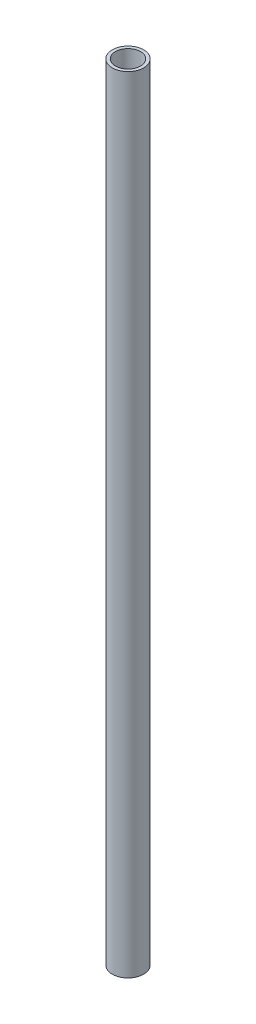
ISO-10303-21;
HEADER;
FILE_DESCRIPTION(('STEP AP214'),'2;1');
FILE_NAME('part.step','',(''),(''),'','','');
FILE_SCHEMA(('AUTOMOTIVE_DESIGN { 1 0 10303 214 1 1 1 1 }'));
ENDSEC;
DATA;
#1=APPLICATION_CONTEXT('core data for automotive mechanical design processes');
#2=APPLICATION_PROTOCOL_DEFINITION('international standard','automotive_design',2000,#1);
#3=PRODUCT_CONTEXT('',#1,'mechanical');
#4=PRODUCT('Part','Part','',(#3));
#5=PRODUCT_RELATED_PRODUCT_CATEGORY('part','',(#4));
#6=PRODUCT_DEFINITION_FORMATION('','',#4);
#7=PRODUCT_DEFINITION_CONTEXT('part definition',#1,'design');
#8=PRODUCT_DEFINITION('design','',#6,#7);
#9=PRODUCT_DEFINITION_SHAPE('','',#8);
#10=(LENGTH_UNIT() NAMED_UNIT(*) SI_UNIT(.MILLI.,.METRE.));
#11=(NAMED_UNIT(*) PLANE_ANGLE_UNIT() SI_UNIT($,.RADIAN.));
#12=(NAMED_UNIT(*) SI_UNIT($,.STERADIAN.) SOLID_ANGLE_UNIT());
#13=UNCERTAINTY_MEASURE_WITH_UNIT(LENGTH_MEASURE(1.E-05),#10,'distance_accuracy_value','');
#14=(GEOMETRIC_REPRESENTATION_CONTEXT(3) GLOBAL_UNCERTAINTY_ASSIGNED_CONTEXT((#13)) GLOBAL_UNIT_ASSIGNED_CONTEXT((#10,
#11,#12)) REPRESENTATION_CONTEXT('',''));
#15=CARTESIAN_POINT('',(0.,0.,0.));
#16=DIRECTION('',(0.,0.,1.));
#17=DIRECTION('',(1.,0.,0.));
#18=AXIS2_PLACEMENT_3D('',#15,#16,#17);
#19=CARTESIAN_POINT('',(0.,500.,0.));
#20=DIRECTION('',(0.,1.,0.));
#21=DIRECTION('',(0.,0.,1.));
#22=AXIS2_PLACEMENT_3D('',#19,#20,#21);
#23=PLANE('',#22);
#24=CARTESIAN_POINT('',(0.,500.,0.));
#25=DIRECTION('',(0.,1.,0.));
#26=DIRECTION('',(0.,0.,1.));
#27=AXIS2_PLACEMENT_3D('',#24,#25,#26);
#28=CIRCLE('',#27,10.);
#29=CARTESIAN_POINT('',(0.,500.,10.));
#30=VERTEX_POINT('',#29);
#31=EDGE_CURVE('E10',#30,#30,#28,.T.);
#32=ORIENTED_EDGE('',*,*,#31,.T.);
#33=EDGE_LOOP('',(#32));
#34=FACE_BOUND('',#33,.T.);
#35=CARTESIAN_POINT('',(0.,500.,0.));
#36=DIRECTION('',(0.,1.,0.));
#37=DIRECTION('',(0.,0.,1.));
#38=AXIS2_PLACEMENT_3D('',#35,#36,#37);
#39=CIRCLE('',#38,8.);
#40=CARTESIAN_POINT('',(0.,500.,8.));
#41=VERTEX_POINT('',#40);
#42=EDGE_CURVE('E45',#41,#41,#39,.T.);
#43=ORIENTED_EDGE('',*,*,#42,.F.);
#44=EDGE_LOOP('',(#43));
#45=FACE_BOUND('',#44,.T.);
#46=ADVANCED_FACE('F34',(#34,#45),#23,.T.);
#47=CARTESIAN_POINT('',(0.,0.,0.));
#48=DIRECTION('',(0.,1.,0.));
#49=DIRECTION('',(0.,0.,1.));
#50=AXIS2_PLACEMENT_3D('',#47,#48,#49);
#51=PLANE('',#50);
#52=CARTESIAN_POINT('',(0.,0.,0.));
#53=DIRECTION('',(0.,1.,0.));
#54=DIRECTION('',(0.,0.,1.));
#55=AXIS2_PLACEMENT_3D('',#52,#53,#54);
#56=CIRCLE('',#55,10.);
#57=CARTESIAN_POINT('',(0.,0.,10.));
#58=VERTEX_POINT('',#57);
#59=EDGE_CURVE('E38',#58,#58,#56,.T.);
#60=ORIENTED_EDGE('',*,*,#59,.F.);
#61=EDGE_LOOP('',(#60));
#62=FACE_BOUND('',#61,.T.);
#63=CARTESIAN_POINT('',(0.,0.,0.));
#64=DIRECTION('',(0.,1.,0.));
#65=DIRECTION('',(0.,0.,1.));
#66=AXIS2_PLACEMENT_3D('',#63,#64,#65);
#67=CIRCLE('',#66,8.);
#68=CARTESIAN_POINT('',(0.,0.,8.));
#69=VERTEX_POINT('',#68);
#70=EDGE_CURVE('E47',#69,#69,#67,.T.);
#71=ORIENTED_EDGE('',*,*,#70,.T.);
#72=EDGE_LOOP('',(#71));
#73=FACE_BOUND('',#72,.T.);
#74=ADVANCED_FACE('F57',(#62,#73),#51,.F.);
#75=CARTESIAN_POINT('',(0.,500.,0.));
#76=DIRECTION('',(0.,-1.,0.));
#77=DIRECTION('',(0.,0.,-1.));
#78=AXIS2_PLACEMENT_3D('',#75,#76,#77);
#79=CYLINDRICAL_SURFACE('',#78,10.);
#80=ORIENTED_EDGE('',*,*,#31,.F.);
#81=EDGE_LOOP('',(#80));
#82=FACE_BOUND('',#81,.T.);
#83=ORIENTED_EDGE('',*,*,#59,.T.);
#84=EDGE_LOOP('',(#83));
#85=FACE_BOUND('',#84,.T.);
#86=ADVANCED_FACE('F36',(#82,#85),#79,.T.);
#87=CARTESIAN_POINT('',(0.,500.,0.));
#88=DIRECTION('',(0.,-1.,0.));
#89=DIRECTION('',(0.,0.,-1.));
#90=AXIS2_PLACEMENT_3D('',#87,#88,#89);
#91=CYLINDRICAL_SURFACE('',#90,8.);
#92=ORIENTED_EDGE('',*,*,#42,.T.);
#93=EDGE_LOOP('',(#92));
#94=FACE_BOUND('',#93,.T.);
#95=ORIENTED_EDGE('',*,*,#70,.F.);
#96=EDGE_LOOP('',(#95));
#97=FACE_BOUND('',#96,.T.);
#98=ADVANCED_FACE('F53',(#94,#97),#91,.F.);
#99=CLOSED_SHELL('',(#46,#74,#86,#98));
#100=MANIFOLD_SOLID_BREP('B2',#99);
#101=ADVANCED_BREP_SHAPE_REPRESENTATION('',(#18,#100),#14);
#102=SHAPE_DEFINITION_REPRESENTATION(#9,#101);
ENDSEC;
END-ISO-10303-21;
